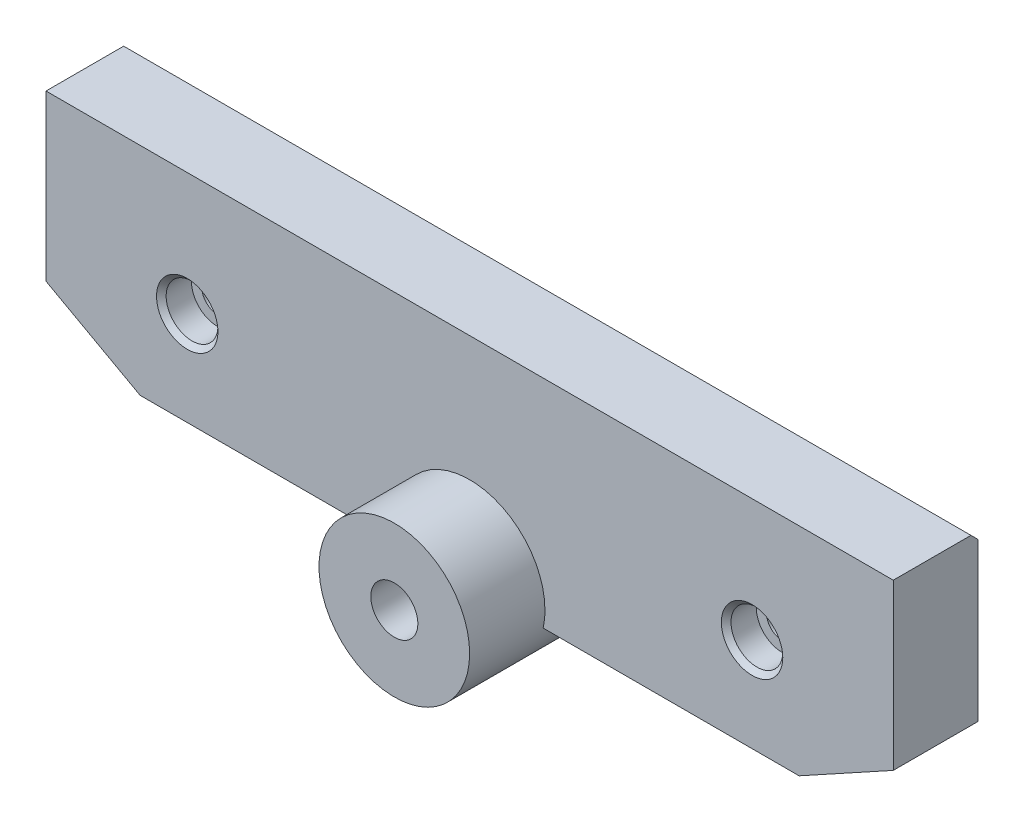
ISO-10303-21;
HEADER;
FILE_DESCRIPTION(('STEP AP214'),'2;1');
FILE_NAME('part.step','',(''),(''),'','','');
FILE_SCHEMA(('AUTOMOTIVE_DESIGN { 1 0 10303 214 1 1 1 1 }'));
ENDSEC;
DATA;
#1=APPLICATION_CONTEXT('core data for automotive mechanical design processes');
#2=APPLICATION_PROTOCOL_DEFINITION('international standard','automotive_design',2000,#1);
#3=PRODUCT_CONTEXT('',#1,'mechanical');
#4=PRODUCT('Part','Part','',(#3));
#5=PRODUCT_RELATED_PRODUCT_CATEGORY('part','',(#4));
#6=PRODUCT_DEFINITION_FORMATION('','',#4);
#7=PRODUCT_DEFINITION_CONTEXT('part definition',#1,'design');
#8=PRODUCT_DEFINITION('design','',#6,#7);
#9=PRODUCT_DEFINITION_SHAPE('','',#8);
#10=(LENGTH_UNIT() NAMED_UNIT(*) SI_UNIT(.MILLI.,.METRE.));
#11=(NAMED_UNIT(*) PLANE_ANGLE_UNIT() SI_UNIT($,.RADIAN.));
#12=(NAMED_UNIT(*) SI_UNIT($,.STERADIAN.) SOLID_ANGLE_UNIT());
#13=UNCERTAINTY_MEASURE_WITH_UNIT(LENGTH_MEASURE(1.E-05),#10,'distance_accuracy_value','');
#14=(GEOMETRIC_REPRESENTATION_CONTEXT(3) GLOBAL_UNCERTAINTY_ASSIGNED_CONTEXT((#13)) GLOBAL_UNIT_ASSIGNED_CONTEXT((#10,
#11,#12)) REPRESENTATION_CONTEXT('',''));
#15=CARTESIAN_POINT('',(0.,0.,0.));
#16=DIRECTION('',(0.,0.,1.));
#17=DIRECTION('',(1.,0.,0.));
#18=AXIS2_PLACEMENT_3D('',#15,#16,#17);
#19=CARTESIAN_POINT('',(-90.,-23.,18.));
#20=DIRECTION('',(0.,1.,0.));
#21=DIRECTION('',(0.,0.,1.));
#22=AXIS2_PLACEMENT_3D('',#19,#20,#21);
#23=PLANE('',#22);
#24=DIRECTION('',(1.,0.,0.));
#25=VECTOR('',#24,1.);
#26=CARTESIAN_POINT('',(-90.,-23.,0.));
#27=LINE('',#26,#25);
#28=CARTESIAN_POINT('',(-70.,-23.,0.));
#29=VERTEX_POINT('',#28);
#30=CARTESIAN_POINT('',(-15.612494995996,-23.,0.));
#31=VERTEX_POINT('',#30);
#32=EDGE_CURVE('E126',#29,#31,#27,.T.);
#33=ORIENTED_EDGE('',*,*,#32,.T.);
#34=DIRECTION('',(0.,0.,1.));
#35=VECTOR('',#34,1.);
#36=CARTESIAN_POINT('',(-15.612494995996,-23.,0.));
#37=LINE('',#36,#35);
#38=CARTESIAN_POINT('',(-15.612494995996,-23.,18.));
#39=VERTEX_POINT('',#38);
#40=EDGE_CURVE('E124',#31,#39,#37,.T.);
#41=ORIENTED_EDGE('',*,*,#40,.T.);
#42=DIRECTION('',(1.,0.,0.));
#43=VECTOR('',#42,1.);
#44=CARTESIAN_POINT('',(-90.,-23.,18.));
#45=LINE('',#44,#43);
#46=CARTESIAN_POINT('',(-70.,-23.,18.));
#47=VERTEX_POINT('',#46);
#48=EDGE_CURVE('E110',#47,#39,#45,.T.);
#49=ORIENTED_EDGE('',*,*,#48,.F.);
#50=DIRECTION('',(0.,0.,-1.));
#51=VECTOR('',#50,1.);
#52=CARTESIAN_POINT('',(-70.,-23.,273.818451906402));
#53=LINE('',#52,#51);
#54=EDGE_CURVE('E162',#47,#29,#53,.T.);
#55=ORIENTED_EDGE('',*,*,#54,.T.);
#56=EDGE_LOOP('',(#33,#41,#49,#55));
#57=FACE_BOUND('',#56,.T.);
#58=ADVANCED_FACE('F40',(#57),#23,.F.);
#59=CARTESIAN_POINT('',(90.,-23.,18.));
#60=DIRECTION('',(-1.,0.,0.));
#61=DIRECTION('',(0.,0.,1.));
#62=AXIS2_PLACEMENT_3D('',#59,#60,#61);
#63=PLANE('',#62);
#64=DIRECTION('',(0.,1.,0.));
#65=VECTOR('',#64,1.);
#66=CARTESIAN_POINT('',(90.,-23.,0.));
#67=LINE('',#66,#65);
#68=CARTESIAN_POINT('',(90.,-12.,0.));
#69=VERTEX_POINT('',#68);
#70=CARTESIAN_POINT('',(90.,21.5,0.));
#71=VERTEX_POINT('',#70);
#72=EDGE_CURVE('E168',#69,#71,#67,.T.);
#73=ORIENTED_EDGE('',*,*,#72,.T.);
#74=DIRECTION('',(0.,0.707106781186548,0.707106781186548));
#75=VECTOR('',#74,1.);
#76=CARTESIAN_POINT('',(90.,23.,1.49999999999997));
#77=LINE('',#76,#75);
#78=CARTESIAN_POINT('',(90.,23.,1.49999999999997));
#79=VERTEX_POINT('',#78);
#80=EDGE_CURVE('E11',#71,#79,#77,.T.);
#81=ORIENTED_EDGE('',*,*,#80,.T.);
#82=DIRECTION('',(0.,0.,-1.));
#83=VECTOR('',#82,1.);
#84=CARTESIAN_POINT('',(90.,23.,18.));
#85=LINE('',#84,#83);
#86=CARTESIAN_POINT('',(90.,23.,18.));
#87=VERTEX_POINT('',#86);
#88=EDGE_CURVE('E137',#87,#79,#85,.T.);
#89=ORIENTED_EDGE('',*,*,#88,.F.);
#90=DIRECTION('',(0.,1.,0.));
#91=VECTOR('',#90,1.);
#92=CARTESIAN_POINT('',(90.,-23.,18.));
#93=LINE('',#92,#91);
#94=CARTESIAN_POINT('',(90.,-12.,18.));
#95=VERTEX_POINT('',#94);
#96=EDGE_CURVE('E169',#95,#87,#93,.T.);
#97=ORIENTED_EDGE('',*,*,#96,.F.);
#98=DIRECTION('',(0.,0.,-1.));
#99=VECTOR('',#98,1.);
#100=CARTESIAN_POINT('',(90.,-12.,273.818451906402));
#101=LINE('',#100,#99);
#102=EDGE_CURVE('E157',#95,#69,#101,.T.);
#103=ORIENTED_EDGE('',*,*,#102,.T.);
#104=EDGE_LOOP('',(#73,#81,#89,#97,#103));
#105=FACE_BOUND('',#104,.T.);
#106=ADVANCED_FACE('F193',(#105),#63,.F.);
#107=CARTESIAN_POINT('',(15.612494995996,-23.,18.));
#108=VERTEX_POINT('',#107);
#109=CARTESIAN_POINT('',(70.,-23.,18.));
#110=VERTEX_POINT('',#109);
#111=EDGE_CURVE('E121',#108,#110,#45,.T.);
#112=ORIENTED_EDGE('',*,*,#111,.F.);
#113=DIRECTION('',(0.,0.,1.));
#114=VECTOR('',#113,1.);
#115=CARTESIAN_POINT('',(15.612494995996,-23.,0.));
#116=LINE('',#115,#114);
#117=CARTESIAN_POINT('',(15.612494995996,-23.,0.));
#118=VERTEX_POINT('',#117);
#119=EDGE_CURVE('E130',#108,#118,#116,.F.);
#120=ORIENTED_EDGE('',*,*,#119,.T.);
#121=CARTESIAN_POINT('',(69.9999999999999,-23.,0.));
#122=VERTEX_POINT('',#121);
#123=EDGE_CURVE('E178',#118,#122,#27,.T.);
#124=ORIENTED_EDGE('',*,*,#123,.T.);
#125=DIRECTION('',(0.,0.,-1.));
#126=VECTOR('',#125,1.);
#127=CARTESIAN_POINT('',(70.,-23.,273.818451906402));
#128=LINE('',#127,#126);
#129=EDGE_CURVE('E153',#110,#122,#128,.T.);
#130=ORIENTED_EDGE('',*,*,#129,.F.);
#131=EDGE_LOOP('',(#112,#120,#124,#130));
#132=FACE_BOUND('',#131,.T.);
#133=ADVANCED_FACE('F204',(#132),#23,.F.);
#134=CARTESIAN_POINT('',(0.,0.,18.));
#135=DIRECTION('',(0.,0.,-1.));
#136=DIRECTION('',(-1.,0.,0.));
#137=AXIS2_PLACEMENT_3D('',#134,#135,#136);
#138=PLANE('',#137);
#139=CARTESIAN_POINT('',(-60.,-3.,18.));
#140=DIRECTION('',(0.,0.,1.));
#141=DIRECTION('',(1.,0.,0.));
#142=AXIS2_PLACEMENT_3D('',#139,#140,#141);
#143=CIRCLE('',#142,6.525);
#144=CARTESIAN_POINT('',(-53.475,-3.,18.));
#145=VERTEX_POINT('',#144);
#146=EDGE_CURVE('E234',#145,#145,#143,.T.);
#147=ORIENTED_EDGE('',*,*,#146,.F.);
#148=EDGE_LOOP('',(#147));
#149=FACE_BOUND('',#148,.T.);
#150=CARTESIAN_POINT('',(60.,-3.,18.));
#151=DIRECTION('',(0.,0.,1.));
#152=DIRECTION('',(1.,0.,0.));
#153=AXIS2_PLACEMENT_3D('',#150,#151,#152);
#154=CIRCLE('',#153,6.525);
#155=CARTESIAN_POINT('',(66.525,-3.,18.));
#156=VERTEX_POINT('',#155);
#157=EDGE_CURVE('E237',#156,#156,#154,.T.);
#158=ORIENTED_EDGE('',*,*,#157,.F.);
#159=EDGE_LOOP('',(#158));
#160=FACE_BOUND('',#159,.T.);
#161=CARTESIAN_POINT('',(0.,-19.5,18.));
#162=DIRECTION('',(0.,0.,1.));
#163=DIRECTION('',(1.,0.,0.));
#164=AXIS2_PLACEMENT_3D('',#161,#162,#163);
#165=CIRCLE('',#164,16.);
#166=EDGE_CURVE('E114',#108,#39,#165,.T.);
#167=ORIENTED_EDGE('',*,*,#166,.F.);
#168=ORIENTED_EDGE('',*,*,#111,.T.);
#169=DIRECTION('',(0.876215908676647,0.481918749772156,0.));
#170=VECTOR('',#169,1.);
#171=CARTESIAN_POINT('',(90.,-12.,18.));
#172=LINE('',#171,#170);
#173=EDGE_CURVE('E129',#110,#95,#172,.T.);
#174=ORIENTED_EDGE('',*,*,#173,.T.);
#175=ORIENTED_EDGE('',*,*,#96,.T.);
#176=DIRECTION('',(-1.,0.,0.));
#177=VECTOR('',#176,1.);
#178=CARTESIAN_POINT('',(-90.,23.,18.));
#179=LINE('',#178,#177);
#180=CARTESIAN_POINT('',(-90.,23.,18.));
#181=VERTEX_POINT('',#180);
#182=EDGE_CURVE('E171',#87,#181,#179,.T.);
#183=ORIENTED_EDGE('',*,*,#182,.T.);
#184=DIRECTION('',(0.,-1.,0.));
#185=VECTOR('',#184,1.);
#186=CARTESIAN_POINT('',(-90.,-23.,18.));
#187=LINE('',#186,#185);
#188=CARTESIAN_POINT('',(-90.,-12.,18.));
#189=VERTEX_POINT('',#188);
#190=EDGE_CURVE('E173',#181,#189,#187,.T.);
#191=ORIENTED_EDGE('',*,*,#190,.T.);
#192=DIRECTION('',(-0.876215908676647,0.481918749772156,0.));
#193=VECTOR('',#192,1.);
#194=CARTESIAN_POINT('',(-90.,-12.,18.));
#195=LINE('',#194,#193);
#196=EDGE_CURVE('E117',#47,#189,#195,.T.);
#197=ORIENTED_EDGE('',*,*,#196,.F.);
#198=ORIENTED_EDGE('',*,*,#48,.T.);
#199=EDGE_LOOP('',(#167,#168,#174,#175,#183,#191,#197,#198));
#200=FACE_BOUND('',#199,.T.);
#201=ADVANCED_FACE('F112',(#149,#160,#200),#138,.F.);
#202=CARTESIAN_POINT('',(0.,0.,0.));
#203=DIRECTION('',(0.,0.,-1.));
#204=DIRECTION('',(-1.,0.,0.));
#205=AXIS2_PLACEMENT_3D('',#202,#203,#204);
#206=PLANE('',#205);
#207=CARTESIAN_POINT('',(-60.,-3.,0.));
#208=DIRECTION('',(0.,0.,1.));
#209=DIRECTION('',(1.,0.,0.));
#210=AXIS2_PLACEMENT_3D('',#207,#208,#209);
#211=CIRCLE('',#210,3.3);
#212=CARTESIAN_POINT('',(-56.7,-3.,0.));
#213=VERTEX_POINT('',#212);
#214=EDGE_CURVE('E240',#213,#213,#211,.T.);
#215=ORIENTED_EDGE('',*,*,#214,.T.);
#216=EDGE_LOOP('',(#215));
#217=FACE_BOUND('',#216,.T.);
#218=CARTESIAN_POINT('',(60.,-3.,0.));
#219=DIRECTION('',(0.,0.,1.));
#220=DIRECTION('',(1.,0.,0.));
#221=AXIS2_PLACEMENT_3D('',#218,#219,#220);
#222=CIRCLE('',#221,3.3);
#223=CARTESIAN_POINT('',(63.3,-3.,0.));
#224=VERTEX_POINT('',#223);
#225=EDGE_CURVE('E255',#224,#224,#222,.T.);
#226=ORIENTED_EDGE('',*,*,#225,.T.);
#227=EDGE_LOOP('',(#226));
#228=FACE_BOUND('',#227,.T.);
#229=CARTESIAN_POINT('',(0.,-19.5,0.));
#230=DIRECTION('',(0.,0.,1.));
#231=DIRECTION('',(1.,0.,0.));
#232=AXIS2_PLACEMENT_3D('',#229,#230,#231);
#233=CIRCLE('',#232,5.);
#234=CARTESIAN_POINT('',(5.,-19.5,0.));
#235=VERTEX_POINT('',#234);
#236=EDGE_CURVE('E259',#235,#235,#233,.T.);
#237=ORIENTED_EDGE('',*,*,#236,.T.);
#238=EDGE_LOOP('',(#237));
#239=FACE_BOUND('',#238,.T.);
#240=DIRECTION('',(0.,-1.,0.));
#241=VECTOR('',#240,1.);
#242=CARTESIAN_POINT('',(-90.,-23.,0.));
#243=LINE('',#242,#241);
#244=CARTESIAN_POINT('',(-90.,21.5,0.));
#245=VERTEX_POINT('',#244);
#246=CARTESIAN_POINT('',(-90.,-12.,0.));
#247=VERTEX_POINT('',#246);
#248=EDGE_CURVE('E176',#245,#247,#243,.T.);
#249=ORIENTED_EDGE('',*,*,#248,.F.);
#250=DIRECTION('',(1.,0.,0.));
#251=VECTOR('',#250,1.);
#252=CARTESIAN_POINT('',(90.,21.5,0.));
#253=LINE('',#252,#251);
#254=EDGE_CURVE('E48',#245,#71,#253,.T.);
#255=ORIENTED_EDGE('',*,*,#254,.T.);
#256=ORIENTED_EDGE('',*,*,#72,.F.);
#257=DIRECTION('',(0.876215908676647,0.481918749772156,0.));
#258=VECTOR('',#257,1.);
#259=CARTESIAN_POINT('',(90.,-12.,0.));
#260=LINE('',#259,#258);
#261=EDGE_CURVE('E150',#122,#69,#260,.T.);
#262=ORIENTED_EDGE('',*,*,#261,.F.);
#263=ORIENTED_EDGE('',*,*,#123,.F.);
#264=CARTESIAN_POINT('',(0.,-19.5,0.));
#265=DIRECTION('',(0.,0.,1.));
#266=DIRECTION('',(1.,0.,0.));
#267=AXIS2_PLACEMENT_3D('',#264,#265,#266);
#268=CIRCLE('',#267,16.);
#269=EDGE_CURVE('E147',#31,#118,#268,.T.);
#270=ORIENTED_EDGE('',*,*,#269,.F.);
#271=ORIENTED_EDGE('',*,*,#32,.F.);
#272=DIRECTION('',(-0.876215908676647,0.481918749772156,0.));
#273=VECTOR('',#272,1.);
#274=CARTESIAN_POINT('',(-90.,-12.,0.));
#275=LINE('',#274,#273);
#276=EDGE_CURVE('E159',#29,#247,#275,.T.);
#277=ORIENTED_EDGE('',*,*,#276,.T.);
#278=EDGE_LOOP('',(#249,#255,#256,#262,#263,#270,#271,#277));
#279=FACE_BOUND('',#278,.T.);
#280=ADVANCED_FACE('F197',(#217,#228,#239,#279),#206,.T.);
#281=CARTESIAN_POINT('',(-90.,23.,18.));
#282=DIRECTION('',(0.,-1.,0.));
#283=DIRECTION('',(0.,0.,-1.));
#284=AXIS2_PLACEMENT_3D('',#281,#282,#283);
#285=PLANE('',#284);
#286=ORIENTED_EDGE('',*,*,#88,.T.);
#287=DIRECTION('',(-1.,0.,0.));
#288=VECTOR('',#287,1.);
#289=CARTESIAN_POINT('',(-90.,23.,1.49999999999997));
#290=LINE('',#289,#288);
#291=CARTESIAN_POINT('',(-90.,23.,1.49999999999997));
#292=VERTEX_POINT('',#291);
#293=EDGE_CURVE('E136',#79,#292,#290,.T.);
#294=ORIENTED_EDGE('',*,*,#293,.T.);
#295=DIRECTION('',(0.,0.,-1.));
#296=VECTOR('',#295,1.);
#297=CARTESIAN_POINT('',(-90.,23.,18.));
#298=LINE('',#297,#296);
#299=EDGE_CURVE('E120',#181,#292,#298,.T.);
#300=ORIENTED_EDGE('',*,*,#299,.F.);
#301=ORIENTED_EDGE('',*,*,#182,.F.);
#302=EDGE_LOOP('',(#286,#294,#300,#301));
#303=FACE_BOUND('',#302,.T.);
#304=ADVANCED_FACE('F187',(#303),#285,.F.);
#305=CARTESIAN_POINT('',(-90.,-23.,18.));
#306=DIRECTION('',(1.,0.,0.));
#307=DIRECTION('',(0.,0.,-1.));
#308=AXIS2_PLACEMENT_3D('',#305,#306,#307);
#309=PLANE('',#308);
#310=ORIENTED_EDGE('',*,*,#299,.T.);
#311=DIRECTION('',(0.,-0.707106781186548,-0.707106781186548));
#312=VECTOR('',#311,1.);
#313=CARTESIAN_POINT('',(-90.,23.,1.49999999999997));
#314=LINE('',#313,#312);
#315=EDGE_CURVE('E62',#292,#245,#314,.T.);
#316=ORIENTED_EDGE('',*,*,#315,.T.);
#317=ORIENTED_EDGE('',*,*,#248,.T.);
#318=DIRECTION('',(0.,0.,-1.));
#319=VECTOR('',#318,1.);
#320=CARTESIAN_POINT('',(-90.,-12.,273.818451906402));
#321=LINE('',#320,#319);
#322=EDGE_CURVE('E165',#189,#247,#321,.T.);
#323=ORIENTED_EDGE('',*,*,#322,.F.);
#324=ORIENTED_EDGE('',*,*,#190,.F.);
#325=EDGE_LOOP('',(#310,#316,#317,#323,#324));
#326=FACE_BOUND('',#325,.T.);
#327=ADVANCED_FACE('F183',(#326),#309,.F.);
#328=CARTESIAN_POINT('',(-90.,-12.,273.818451906402));
#329=DIRECTION('',(0.481918749772156,0.876215908676647,0.));
#330=DIRECTION('',(-0.876215908676647,0.481918749772156,0.));
#331=AXIS2_PLACEMENT_3D('',#328,#329,#330);
#332=PLANE('',#331);
#333=ORIENTED_EDGE('',*,*,#196,.T.);
#334=ORIENTED_EDGE('',*,*,#322,.T.);
#335=ORIENTED_EDGE('',*,*,#276,.F.);
#336=ORIENTED_EDGE('',*,*,#54,.F.);
#337=EDGE_LOOP('',(#333,#334,#335,#336));
#338=FACE_BOUND('',#337,.T.);
#339=ADVANCED_FACE('F206',(#338),#332,.F.);
#340=CARTESIAN_POINT('',(90.,-12.,273.818451906402));
#341=DIRECTION('',(0.481918749772156,-0.876215908676647,0.));
#342=DIRECTION('',(0.876215908676647,0.481918749772156,0.));
#343=AXIS2_PLACEMENT_3D('',#340,#341,#342);
#344=PLANE('',#343);
#345=ORIENTED_EDGE('',*,*,#173,.F.);
#346=ORIENTED_EDGE('',*,*,#129,.T.);
#347=ORIENTED_EDGE('',*,*,#261,.T.);
#348=ORIENTED_EDGE('',*,*,#102,.F.);
#349=EDGE_LOOP('',(#345,#346,#347,#348));
#350=FACE_BOUND('',#349,.T.);
#351=ADVANCED_FACE('F201',(#350),#344,.T.);
#352=CARTESIAN_POINT('',(0.,-19.5,0.));
#353=DIRECTION('',(0.,0.,1.));
#354=DIRECTION('',(1.,0.,0.));
#355=AXIS2_PLACEMENT_3D('',#352,#353,#354);
#356=CYLINDRICAL_SURFACE('',#355,16.);
#357=ORIENTED_EDGE('',*,*,#40,.F.);
#358=ORIENTED_EDGE('',*,*,#269,.T.);
#359=ORIENTED_EDGE('',*,*,#119,.F.);
#360=ORIENTED_EDGE('',*,*,#166,.T.);
#361=EDGE_LOOP('',(#357,#358,#359,#360));
#362=FACE_BOUND('',#361,.T.);
#363=CARTESIAN_POINT('',(0.,-19.5,34.));
#364=DIRECTION('',(0.,0.,1.));
#365=DIRECTION('',(1.,0.,0.));
#366=AXIS2_PLACEMENT_3D('',#363,#364,#365);
#367=CIRCLE('',#366,16.);
#368=CARTESIAN_POINT('',(16.,-19.5,34.));
#369=VERTEX_POINT('',#368);
#370=EDGE_CURVE('E145',#369,#369,#367,.T.);
#371=ORIENTED_EDGE('',*,*,#370,.F.);
#372=EDGE_LOOP('',(#371));
#373=FACE_BOUND('',#372,.T.);
#374=ADVANCED_FACE('F132',(#362,#373),#356,.T.);
#375=CARTESIAN_POINT('',(0.,-19.5,34.));
#376=DIRECTION('',(0.,0.,1.));
#377=DIRECTION('',(1.,0.,0.));
#378=AXIS2_PLACEMENT_3D('',#375,#376,#377);
#379=PLANE('',#378);
#380=CARTESIAN_POINT('',(0.,-19.5,34.));
#381=DIRECTION('',(0.,0.,1.));
#382=DIRECTION('',(1.,0.,0.));
#383=AXIS2_PLACEMENT_3D('',#380,#381,#382);
#384=CIRCLE('',#383,5.);
#385=CARTESIAN_POINT('',(5.,-19.5,34.));
#386=VERTEX_POINT('',#385);
#387=EDGE_CURVE('E258',#386,#386,#384,.T.);
#388=ORIENTED_EDGE('',*,*,#387,.F.);
#389=EDGE_LOOP('',(#388));
#390=FACE_BOUND('',#389,.T.);
#391=ORIENTED_EDGE('',*,*,#370,.T.);
#392=EDGE_LOOP('',(#391));
#393=FACE_BOUND('',#392,.T.);
#394=ADVANCED_FACE('F266',(#390,#393),#379,.T.);
#395=CARTESIAN_POINT('',(0.,-19.5,0.));
#396=DIRECTION('',(0.,0.,1.));
#397=DIRECTION('',(1.,0.,0.));
#398=AXIS2_PLACEMENT_3D('',#395,#396,#397);
#399=CYLINDRICAL_SURFACE('',#398,5.);
#400=ORIENTED_EDGE('',*,*,#236,.F.);
#401=EDGE_LOOP('',(#400));
#402=FACE_BOUND('',#401,.T.);
#403=ORIENTED_EDGE('',*,*,#387,.T.);
#404=EDGE_LOOP('',(#403));
#405=FACE_BOUND('',#404,.T.);
#406=ADVANCED_FACE('F264',(#402,#405),#399,.F.);
#407=CARTESIAN_POINT('',(60.,-3.,18.));
#408=DIRECTION('',(0.,0.,1.));
#409=DIRECTION('',(1.,0.,0.));
#410=AXIS2_PLACEMENT_3D('',#407,#408,#409);
#411=CYLINDRICAL_SURFACE('',#410,3.3);
#412=ORIENTED_EDGE('',*,*,#225,.F.);
#413=EDGE_LOOP('',(#412));
#414=FACE_BOUND('',#413,.T.);
#415=CARTESIAN_POINT('',(60.,-3.,11.6));
#416=DIRECTION('',(0.,0.,1.));
#417=DIRECTION('',(1.,0.,0.));
#418=AXIS2_PLACEMENT_3D('',#415,#416,#417);
#419=CIRCLE('',#418,3.3);
#420=CARTESIAN_POINT('',(63.3,-3.,11.6));
#421=VERTEX_POINT('',#420);
#422=EDGE_CURVE('E252',#421,#421,#419,.T.);
#423=ORIENTED_EDGE('',*,*,#422,.T.);
#424=EDGE_LOOP('',(#423));
#425=FACE_BOUND('',#424,.T.);
#426=ADVANCED_FACE('F279',(#414,#425),#411,.F.);
#427=CARTESIAN_POINT('',(65.5,-3.,11.6));
#428=DIRECTION('',(0.,0.,-1.));
#429=DIRECTION('',(-1.,0.,0.));
#430=AXIS2_PLACEMENT_3D('',#427,#428,#429);
#431=PLANE('',#430);
#432=ORIENTED_EDGE('',*,*,#422,.F.);
#433=EDGE_LOOP('',(#432));
#434=FACE_BOUND('',#433,.T.);
#435=CARTESIAN_POINT('',(60.,-3.,11.6));
#436=DIRECTION('',(0.,0.,1.));
#437=DIRECTION('',(1.,0.,0.));
#438=AXIS2_PLACEMENT_3D('',#435,#436,#437);
#439=CIRCLE('',#438,5.50000000000001);
#440=CARTESIAN_POINT('',(65.5,-3.,11.6));
#441=VERTEX_POINT('',#440);
#442=EDGE_CURVE('E243',#441,#441,#439,.T.);
#443=ORIENTED_EDGE('',*,*,#442,.T.);
#444=EDGE_LOOP('',(#443));
#445=FACE_BOUND('',#444,.T.);
#446=ADVANCED_FACE('F283',(#434,#445),#431,.F.);
#447=CARTESIAN_POINT('',(60.,-3.,18.));
#448=DIRECTION('',(0.,0.,1.));
#449=DIRECTION('',(1.,0.,0.));
#450=AXIS2_PLACEMENT_3D('',#447,#448,#449);
#451=CYLINDRICAL_SURFACE('',#450,5.50000000000001);
#452=ORIENTED_EDGE('',*,*,#442,.F.);
#453=EDGE_LOOP('',(#452));
#454=FACE_BOUND('',#453,.T.);
#455=CARTESIAN_POINT('',(60.,-3.,16.975));
#456=DIRECTION('',(0.,0.,1.));
#457=DIRECTION('',(1.,0.,0.));
#458=AXIS2_PLACEMENT_3D('',#455,#456,#457);
#459=CIRCLE('',#458,5.50000000000001);
#460=CARTESIAN_POINT('',(65.5,-3.,16.975));
#461=VERTEX_POINT('',#460);
#462=EDGE_CURVE('E239',#461,#461,#459,.T.);
#463=ORIENTED_EDGE('',*,*,#462,.T.);
#464=EDGE_LOOP('',(#463));
#465=FACE_BOUND('',#464,.T.);
#466=ADVANCED_FACE('F287',(#454,#465),#451,.F.);
#467=CARTESIAN_POINT('',(60.,-3.,18.));
#468=DIRECTION('',(0.,0.,1.));
#469=DIRECTION('',(1.,0.,0.));
#470=AXIS2_PLACEMENT_3D('',#467,#468,#469);
#471=CONICAL_SURFACE('',#470,6.525,0.785398163397447);
#472=ORIENTED_EDGE('',*,*,#462,.F.);
#473=EDGE_LOOP('',(#472));
#474=FACE_BOUND('',#473,.T.);
#475=ORIENTED_EDGE('',*,*,#157,.T.);
#476=EDGE_LOOP('',(#475));
#477=FACE_BOUND('',#476,.T.);
#478=ADVANCED_FACE('F291',(#474,#477),#471,.F.);
#479=CARTESIAN_POINT('',(-60.,-3.,18.));
#480=DIRECTION('',(0.,0.,1.));
#481=DIRECTION('',(1.,0.,0.));
#482=AXIS2_PLACEMENT_3D('',#479,#480,#481);
#483=CYLINDRICAL_SURFACE('',#482,3.3);
#484=ORIENTED_EDGE('',*,*,#214,.F.);
#485=EDGE_LOOP('',(#484));
#486=FACE_BOUND('',#485,.T.);
#487=CARTESIAN_POINT('',(-60.,-3.,11.6));
#488=DIRECTION('',(0.,0.,1.));
#489=DIRECTION('',(1.,0.,0.));
#490=AXIS2_PLACEMENT_3D('',#487,#488,#489);
#491=CIRCLE('',#490,3.3);
#492=CARTESIAN_POINT('',(-56.7,-3.,11.6));
#493=VERTEX_POINT('',#492);
#494=EDGE_CURVE('E246',#493,#493,#491,.T.);
#495=ORIENTED_EDGE('',*,*,#494,.T.);
#496=EDGE_LOOP('',(#495));
#497=FACE_BOUND('',#496,.T.);
#498=ADVANCED_FACE('F295',(#486,#497),#483,.F.);
#499=CARTESIAN_POINT('',(-54.5,-3.,11.6));
#500=DIRECTION('',(0.,0.,-1.));
#501=DIRECTION('',(-1.,0.,0.));
#502=AXIS2_PLACEMENT_3D('',#499,#500,#501);
#503=PLANE('',#502);
#504=ORIENTED_EDGE('',*,*,#494,.F.);
#505=EDGE_LOOP('',(#504));
#506=FACE_BOUND('',#505,.T.);
#507=CARTESIAN_POINT('',(-60.,-3.,11.6));
#508=DIRECTION('',(0.,0.,1.));
#509=DIRECTION('',(1.,0.,0.));
#510=AXIS2_PLACEMENT_3D('',#507,#508,#509);
#511=CIRCLE('',#510,5.5);
#512=CARTESIAN_POINT('',(-54.5,-3.,11.6));
#513=VERTEX_POINT('',#512);
#514=EDGE_CURVE('E319',#513,#513,#511,.T.);
#515=ORIENTED_EDGE('',*,*,#514,.T.);
#516=EDGE_LOOP('',(#515));
#517=FACE_BOUND('',#516,.T.);
#518=ADVANCED_FACE('F299',(#506,#517),#503,.F.);
#519=CARTESIAN_POINT('',(-60.,-3.,18.));
#520=DIRECTION('',(0.,0.,1.));
#521=DIRECTION('',(1.,0.,0.));
#522=AXIS2_PLACEMENT_3D('',#519,#520,#521);
#523=CYLINDRICAL_SURFACE('',#522,5.5);
#524=ORIENTED_EDGE('',*,*,#514,.F.);
#525=EDGE_LOOP('',(#524));
#526=FACE_BOUND('',#525,.T.);
#527=CARTESIAN_POINT('',(-60.,-3.,16.975));
#528=DIRECTION('',(0.,0.,1.));
#529=DIRECTION('',(1.,0.,0.));
#530=AXIS2_PLACEMENT_3D('',#527,#528,#529);
#531=CIRCLE('',#530,5.5);
#532=CARTESIAN_POINT('',(-54.5,-3.,16.975));
#533=VERTEX_POINT('',#532);
#534=EDGE_CURVE('E317',#533,#533,#531,.T.);
#535=ORIENTED_EDGE('',*,*,#534,.T.);
#536=EDGE_LOOP('',(#535));
#537=FACE_BOUND('',#536,.T.);
#538=ADVANCED_FACE('F303',(#526,#537),#523,.F.);
#539=CARTESIAN_POINT('',(-60.,-3.,18.));
#540=DIRECTION('',(0.,0.,1.));
#541=DIRECTION('',(1.,0.,0.));
#542=AXIS2_PLACEMENT_3D('',#539,#540,#541);
#543=CONICAL_SURFACE('',#542,6.525,0.78539816339745);
#544=ORIENTED_EDGE('',*,*,#534,.F.);
#545=EDGE_LOOP('',(#544));
#546=FACE_BOUND('',#545,.T.);
#547=ORIENTED_EDGE('',*,*,#146,.T.);
#548=EDGE_LOOP('',(#547));
#549=FACE_BOUND('',#548,.T.);
#550=ADVANCED_FACE('F307',(#546,#549),#543,.F.);
#551=CARTESIAN_POINT('',(-90.,23.,1.49999999999997));
#552=DIRECTION('',(0.,0.707106781186548,-0.707106781186548));
#553=DIRECTION('',(1.,0.,0.));
#554=AXIS2_PLACEMENT_3D('',#551,#552,#553);
#555=PLANE('',#554);
#556=ORIENTED_EDGE('',*,*,#80,.F.);
#557=ORIENTED_EDGE('',*,*,#254,.F.);
#558=ORIENTED_EDGE('',*,*,#315,.F.);
#559=ORIENTED_EDGE('',*,*,#293,.F.);
#560=EDGE_LOOP('',(#556,#557,#558,#559));
#561=FACE_BOUND('',#560,.T.);
#562=ADVANCED_FACE('F42',(#561),#555,.T.);
#563=CLOSED_SHELL('',(#58,#106,#133,#201,#280,#304,#327,#339,#351,#374,#394,#406,#426,#446,#466,
#478,#498,#518,#538,#550,#562));
#564=MANIFOLD_SOLID_BREP('B2',#563);
#565=ADVANCED_BREP_SHAPE_REPRESENTATION('',(#18,#564),#14);
#566=SHAPE_DEFINITION_REPRESENTATION(#9,#565);
ENDSEC;
END-ISO-10303-21;
